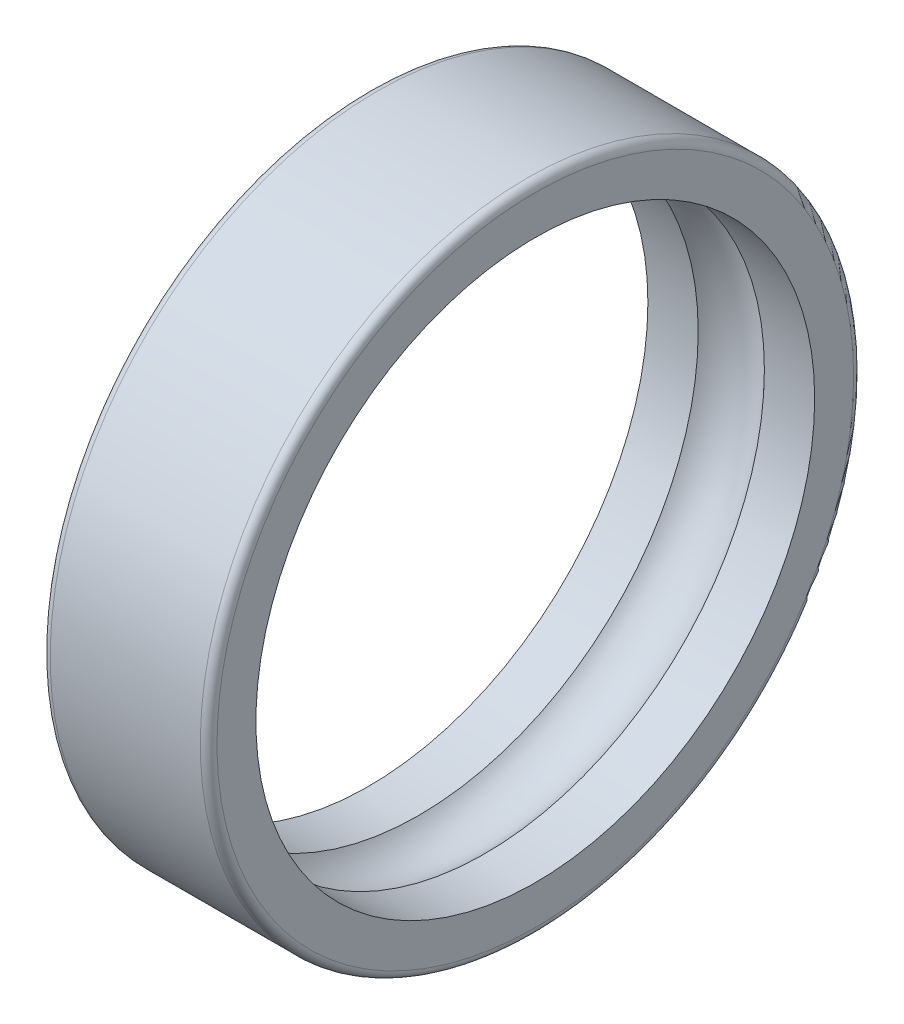
ISO-10303-21;
HEADER;
FILE_DESCRIPTION(('STEP AP214'),'2;1');
FILE_NAME('part.step','',(''),(''),'','','');
FILE_SCHEMA(('AUTOMOTIVE_DESIGN { 1 0 10303 214 1 1 1 1 }'));
ENDSEC;
DATA;
#1=APPLICATION_CONTEXT('core data for automotive mechanical design processes');
#2=APPLICATION_PROTOCOL_DEFINITION('international standard','automotive_design',2000,#1);
#3=PRODUCT_CONTEXT('',#1,'mechanical');
#4=PRODUCT('Part','Part','',(#3));
#5=PRODUCT_RELATED_PRODUCT_CATEGORY('part','',(#4));
#6=PRODUCT_DEFINITION_FORMATION('','',#4);
#7=PRODUCT_DEFINITION_CONTEXT('part definition',#1,'design');
#8=PRODUCT_DEFINITION('design','',#6,#7);
#9=PRODUCT_DEFINITION_SHAPE('','',#8);
#10=(LENGTH_UNIT() NAMED_UNIT(*) SI_UNIT(.MILLI.,.METRE.));
#11=(NAMED_UNIT(*) PLANE_ANGLE_UNIT() SI_UNIT($,.RADIAN.));
#12=(NAMED_UNIT(*) SI_UNIT($,.STERADIAN.) SOLID_ANGLE_UNIT());
#13=UNCERTAINTY_MEASURE_WITH_UNIT(LENGTH_MEASURE(1.E-05),#10,'distance_accuracy_value','');
#14=(GEOMETRIC_REPRESENTATION_CONTEXT(3) GLOBAL_UNCERTAINTY_ASSIGNED_CONTEXT((#13)) GLOBAL_UNIT_ASSIGNED_CONTEXT((#10,
#11,#12)) REPRESENTATION_CONTEXT('',''));
#15=CARTESIAN_POINT('',(0.,0.,0.));
#16=DIRECTION('',(0.,0.,1.));
#17=DIRECTION('',(1.,0.,0.));
#18=AXIS2_PLACEMENT_3D('',#15,#16,#17);
#19=CARTESIAN_POINT('',(6.,0.,0.));
#20=DIRECTION('',(1.,0.,0.));
#21=DIRECTION('',(0.,1.,0.));
#22=AXIS2_PLACEMENT_3D('',#19,#20,#21);
#23=TOROIDAL_SURFACE('',#22,18.,3.175);
#24=CARTESIAN_POINT('',(3.61869258599399,0.,0.));
#25=DIRECTION('',(1.,0.,0.));
#26=DIRECTION('',(0.,0.,1.));
#27=AXIS2_PLACEMENT_3D('',#24,#25,#26);
#28=CIRCLE('',#27,20.1);
#29=CARTESIAN_POINT('',(3.61869258599399,-20.1,0.));
#30=VERTEX_POINT('',#29);
#31=EDGE_CURVE('E26',#30,#30,#28,.T.);
#32=ORIENTED_EDGE('',*,*,#31,.F.);
#33=EDGE_LOOP('',(#32));
#34=FACE_BOUND('',#33,.T.);
#35=CARTESIAN_POINT('',(8.38130741400601,0.,0.));
#36=DIRECTION('',(1.,0.,0.));
#37=DIRECTION('',(0.,0.,1.));
#38=AXIS2_PLACEMENT_3D('',#35,#36,#37);
#39=CIRCLE('',#38,20.1);
#40=CARTESIAN_POINT('',(8.38130741400601,0.,-20.1));
#41=VERTEX_POINT('',#40);
#42=EDGE_CURVE('E11',#41,#41,#39,.T.);
#43=ORIENTED_EDGE('',*,*,#42,.T.);
#44=EDGE_LOOP('',(#43));
#45=FACE_BOUND('',#44,.T.);
#46=ADVANCED_FACE('F16',(#34,#45),#23,.F.);
#47=CARTESIAN_POINT('',(1.80934629299699,0.,0.));
#48=DIRECTION('',(1.,0.,0.));
#49=DIRECTION('',(0.,0.,1.));
#50=AXIS2_PLACEMENT_3D('',#47,#48,#49);
#51=CYLINDRICAL_SURFACE('',#50,20.1);
#52=ORIENTED_EDGE('',*,*,#31,.T.);
#53=EDGE_LOOP('',(#52));
#54=FACE_BOUND('',#53,.T.);
#55=CARTESIAN_POINT('',(0.,0.,0.));
#56=DIRECTION('',(1.,0.,0.));
#57=DIRECTION('',(0.,0.,1.));
#58=AXIS2_PLACEMENT_3D('',#55,#56,#57);
#59=CIRCLE('',#58,20.1);
#60=CARTESIAN_POINT('',(0.,0.,-20.1));
#61=VERTEX_POINT('',#60);
#62=EDGE_CURVE('E70',#61,#61,#59,.T.);
#63=ORIENTED_EDGE('',*,*,#62,.F.);
#64=EDGE_LOOP('',(#63));
#65=FACE_BOUND('',#64,.T.);
#66=ADVANCED_FACE('F71',(#54,#65),#51,.F.);
#67=CARTESIAN_POINT('',(10.190653707003,0.,0.));
#68=DIRECTION('',(1.,0.,0.));
#69=DIRECTION('',(0.,0.,1.));
#70=AXIS2_PLACEMENT_3D('',#67,#68,#69);
#71=CYLINDRICAL_SURFACE('',#70,20.1);
#72=CARTESIAN_POINT('',(12.,0.,0.));
#73=DIRECTION('',(1.,0.,0.));
#74=DIRECTION('',(0.,0.,1.));
#75=AXIS2_PLACEMENT_3D('',#72,#73,#74);
#76=CIRCLE('',#75,20.1);
#77=CARTESIAN_POINT('',(12.,0.,-20.1));
#78=VERTEX_POINT('',#77);
#79=EDGE_CURVE('E64',#78,#78,#76,.T.);
#80=ORIENTED_EDGE('',*,*,#79,.T.);
#81=EDGE_LOOP('',(#80));
#82=FACE_BOUND('',#81,.T.);
#83=ORIENTED_EDGE('',*,*,#42,.F.);
#84=EDGE_LOOP('',(#83));
#85=FACE_BOUND('',#84,.T.);
#86=ADVANCED_FACE('F121',(#82,#85),#71,.F.);
#87=CARTESIAN_POINT('',(11.4,0.,0.));
#88=DIRECTION('',(1.,0.,0.));
#89=DIRECTION('',(0.,1.,0.));
#90=AXIS2_PLACEMENT_3D('',#87,#88,#89);
#91=TOROIDAL_SURFACE('',#90,22.9,0.6);
#92=CARTESIAN_POINT('',(12.,0.,0.));
#93=DIRECTION('',(1.,0.,0.));
#94=DIRECTION('',(0.,0.,1.));
#95=AXIS2_PLACEMENT_3D('',#92,#93,#94);
#96=CIRCLE('',#95,22.9);
#97=CARTESIAN_POINT('',(12.,-22.9,0.));
#98=VERTEX_POINT('',#97);
#99=EDGE_CURVE('E57',#98,#98,#96,.T.);
#100=ORIENTED_EDGE('',*,*,#99,.F.);
#101=EDGE_LOOP('',(#100));
#102=FACE_BOUND('',#101,.T.);
#103=CARTESIAN_POINT('',(11.4,0.,0.));
#104=DIRECTION('',(1.,0.,0.));
#105=DIRECTION('',(0.,0.,1.));
#106=AXIS2_PLACEMENT_3D('',#103,#104,#105);
#107=CIRCLE('',#106,23.5);
#108=CARTESIAN_POINT('',(11.4,0.,-23.5));
#109=VERTEX_POINT('',#108);
#110=EDGE_CURVE('E86',#109,#109,#107,.T.);
#111=ORIENTED_EDGE('',*,*,#110,.T.);
#112=EDGE_LOOP('',(#111));
#113=FACE_BOUND('',#112,.T.);
#114=ADVANCED_FACE('F114',(#102,#113),#91,.T.);
#115=CARTESIAN_POINT('',(6.,0.,0.));
#116=DIRECTION('',(1.,0.,0.));
#117=DIRECTION('',(0.,0.,1.));
#118=AXIS2_PLACEMENT_3D('',#115,#116,#117);
#119=CYLINDRICAL_SURFACE('',#118,23.5);
#120=ORIENTED_EDGE('',*,*,#110,.F.);
#121=EDGE_LOOP('',(#120));
#122=FACE_BOUND('',#121,.T.);
#123=CARTESIAN_POINT('',(0.6,0.,0.));
#124=DIRECTION('',(1.,0.,0.));
#125=DIRECTION('',(0.,0.,1.));
#126=AXIS2_PLACEMENT_3D('',#123,#124,#125);
#127=CIRCLE('',#126,23.5);
#128=CARTESIAN_POINT('',(0.6,23.5,0.));
#129=VERTEX_POINT('',#128);
#130=EDGE_CURVE('E82',#129,#129,#127,.T.);
#131=ORIENTED_EDGE('',*,*,#130,.T.);
#132=EDGE_LOOP('',(#131));
#133=FACE_BOUND('',#132,.T.);
#134=ADVANCED_FACE('F102',(#122,#133),#119,.T.);
#135=CARTESIAN_POINT('',(0.6,0.,0.));
#136=DIRECTION('',(1.,0.,0.));
#137=DIRECTION('',(0.,1.,0.));
#138=AXIS2_PLACEMENT_3D('',#135,#136,#137);
#139=TOROIDAL_SURFACE('',#138,22.9,0.6);
#140=ORIENTED_EDGE('',*,*,#130,.F.);
#141=EDGE_LOOP('',(#140));
#142=FACE_BOUND('',#141,.T.);
#143=CARTESIAN_POINT('',(0.,0.,0.));
#144=DIRECTION('',(1.,0.,0.));
#145=DIRECTION('',(0.,0.,1.));
#146=AXIS2_PLACEMENT_3D('',#143,#144,#145);
#147=CIRCLE('',#146,22.9);
#148=CARTESIAN_POINT('',(0.,-22.9,0.));
#149=VERTEX_POINT('',#148);
#150=EDGE_CURVE('E79',#149,#149,#147,.T.);
#151=ORIENTED_EDGE('',*,*,#150,.T.);
#152=EDGE_LOOP('',(#151));
#153=FACE_BOUND('',#152,.T.);
#154=ADVANCED_FACE('F104',(#142,#153),#139,.T.);
#155=CARTESIAN_POINT('',(12.,0.,21.5));
#156=DIRECTION('',(1.,0.,0.));
#157=DIRECTION('',(0.,0.,1.));
#158=AXIS2_PLACEMENT_3D('',#155,#156,#157);
#159=PLANE('',#158);
#160=ORIENTED_EDGE('',*,*,#99,.T.);
#161=EDGE_LOOP('',(#160));
#162=FACE_BOUND('',#161,.T.);
#163=ORIENTED_EDGE('',*,*,#79,.F.);
#164=EDGE_LOOP('',(#163));
#165=FACE_BOUND('',#164,.T.);
#166=ADVANCED_FACE('F18',(#162,#165),#159,.T.);
#167=CARTESIAN_POINT('',(0.,0.,21.5));
#168=DIRECTION('',(-1.,0.,0.));
#169=DIRECTION('',(0.,0.,1.));
#170=AXIS2_PLACEMENT_3D('',#167,#168,#169);
#171=PLANE('',#170);
#172=ORIENTED_EDGE('',*,*,#150,.F.);
#173=EDGE_LOOP('',(#172));
#174=FACE_BOUND('',#173,.T.);
#175=ORIENTED_EDGE('',*,*,#62,.T.);
#176=EDGE_LOOP('',(#175));
#177=FACE_BOUND('',#176,.T.);
#178=ADVANCED_FACE('F112',(#174,#177),#171,.T.);
#179=CLOSED_SHELL('',(#46,#66,#86,#114,#134,#154,#166,#178));
#180=MANIFOLD_SOLID_BREP('B1',#179);
#181=ADVANCED_BREP_SHAPE_REPRESENTATION('',(#18,#180),#14);
#182=SHAPE_DEFINITION_REPRESENTATION(#9,#181);
ENDSEC;
END-ISO-10303-21;
